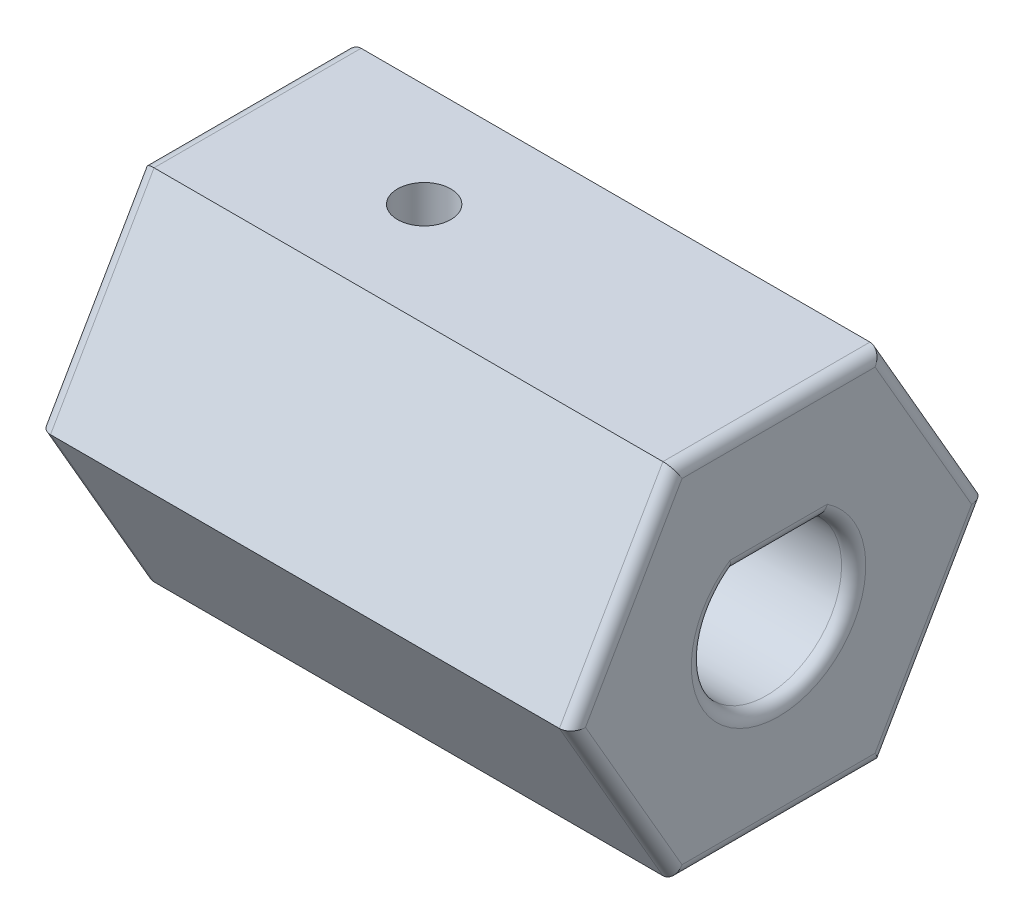
ISO-10303-21;
HEADER;
FILE_DESCRIPTION(('STEP AP214'),'2;1');
FILE_NAME('part.step','',(''),(''),'','','');
FILE_SCHEMA(('AUTOMOTIVE_DESIGN { 1 0 10303 214 1 1 1 1 }'));
ENDSEC;
DATA;
#1=APPLICATION_CONTEXT('core data for automotive mechanical design processes');
#2=APPLICATION_PROTOCOL_DEFINITION('international standard','automotive_design',2000,#1);
#3=PRODUCT_CONTEXT('',#1,'mechanical');
#4=PRODUCT('Part','Part','',(#3));
#5=PRODUCT_RELATED_PRODUCT_CATEGORY('part','',(#4));
#6=PRODUCT_DEFINITION_FORMATION('','',#4);
#7=PRODUCT_DEFINITION_CONTEXT('part definition',#1,'design');
#8=PRODUCT_DEFINITION('design','',#6,#7);
#9=PRODUCT_DEFINITION_SHAPE('','',#8);
#10=(LENGTH_UNIT() NAMED_UNIT(*) SI_UNIT(.MILLI.,.METRE.));
#11=(NAMED_UNIT(*) PLANE_ANGLE_UNIT() SI_UNIT($,.RADIAN.));
#12=(NAMED_UNIT(*) SI_UNIT($,.STERADIAN.) SOLID_ANGLE_UNIT());
#13=UNCERTAINTY_MEASURE_WITH_UNIT(LENGTH_MEASURE(1.E-05),#10,'distance_accuracy_value','');
#14=(GEOMETRIC_REPRESENTATION_CONTEXT(3) GLOBAL_UNCERTAINTY_ASSIGNED_CONTEXT((#13)) GLOBAL_UNIT_ASSIGNED_CONTEXT((#10,
#11,#12)) REPRESENTATION_CONTEXT('',''));
#15=CARTESIAN_POINT('',(0.,0.,0.));
#16=DIRECTION('',(0.,0.,1.));
#17=DIRECTION('',(1.,0.,0.));
#18=AXIS2_PLACEMENT_3D('',#15,#16,#17);
#19=CARTESIAN_POINT('',(22.,0.,0.));
#20=DIRECTION('',(1.,0.,0.));
#21=DIRECTION('',(0.,0.,-1.));
#22=AXIS2_PLACEMENT_3D('',#19,#20,#21);
#23=PLANE('',#22);
#24=DIRECTION('',(0.,0.,1.));
#25=VECTOR('',#24,1.);
#26=CARTESIAN_POINT('',(22.,2.98746859276655,-1.85));
#27=LINE('',#26,#25);
#28=CARTESIAN_POINT('',(22.,2.98746859276655,2.00873876032536));
#29=VERTEX_POINT('',#28);
#30=CARTESIAN_POINT('',(22.,2.98746859276655,-2.00873876032536));
#31=VERTEX_POINT('',#30);
#32=EDGE_CURVE('E64',#29,#31,#27,.F.);
#33=ORIENTED_EDGE('',*,*,#32,.T.);
#34=CARTESIAN_POINT('',(22.,0.,0.));
#35=DIRECTION('',(1.,0.,0.));
#36=DIRECTION('',(0.,0.,-1.));
#37=AXIS2_PLACEMENT_3D('',#34,#35,#36);
#38=CIRCLE('',#37,3.6);
#39=EDGE_CURVE('E12',#31,#29,#38,.F.);
#40=ORIENTED_EDGE('',*,*,#39,.T.);
#41=EDGE_LOOP('',(#33,#40));
#42=FACE_BOUND('',#41,.T.);
#43=DIRECTION('',(0.,0.,1.));
#44=VECTOR('',#43,1.);
#45=CARTESIAN_POINT('',(22.,6.9,4.27239199200323));
#46=LINE('',#45,#44);
#47=CARTESIAN_POINT('',(22.,6.9,-3.98371685740842));
#48=VERTEX_POINT('',#47);
#49=CARTESIAN_POINT('',(22.,6.9,3.98371685740842));
#50=VERTEX_POINT('',#49);
#51=EDGE_CURVE('E232',#48,#50,#46,.T.);
#52=ORIENTED_EDGE('',*,*,#51,.T.);
#53=DIRECTION('',(0.,-0.866025403784439,0.5));
#54=VECTOR('',#53,1.);
#55=CARTESIAN_POINT('',(22.,-0.249999999999998,8.11177128211424));
#56=LINE('',#55,#54);
#57=CARTESIAN_POINT('',(22.,0.,7.96743371481684));
#58=VERTEX_POINT('',#57);
#59=EDGE_CURVE('E234',#50,#58,#56,.T.);
#60=ORIENTED_EDGE('',*,*,#59,.T.);
#61=DIRECTION('',(0.,-0.866025403784438,-0.5));
#62=VECTOR('',#61,1.);
#63=CARTESIAN_POINT('',(22.,-7.15,3.83937929011101));
#64=LINE('',#63,#62);
#65=CARTESIAN_POINT('',(22.,-6.9,3.98371685740841));
#66=VERTEX_POINT('',#65);
#67=EDGE_CURVE('E225',#58,#66,#64,.T.);
#68=ORIENTED_EDGE('',*,*,#67,.T.);
#69=DIRECTION('',(0.,0.,-1.));
#70=VECTOR('',#69,1.);
#71=CARTESIAN_POINT('',(22.,-6.9,-4.27239199200323));
#72=LINE('',#71,#70);
#73=CARTESIAN_POINT('',(22.,-6.9,-3.98371685740842));
#74=VERTEX_POINT('',#73);
#75=EDGE_CURVE('E199',#66,#74,#72,.T.);
#76=ORIENTED_EDGE('',*,*,#75,.T.);
#77=DIRECTION('',(0.,0.866025403784439,-0.5));
#78=VECTOR('',#77,1.);
#79=CARTESIAN_POINT('',(22.,0.250000000000004,-8.11177128211425));
#80=LINE('',#79,#78);
#81=CARTESIAN_POINT('',(22.,0.,-7.96743371481684));
#82=VERTEX_POINT('',#81);
#83=EDGE_CURVE('E228',#74,#82,#80,.T.);
#84=ORIENTED_EDGE('',*,*,#83,.T.);
#85=DIRECTION('',(0.,0.866025403784438,0.5));
#86=VECTOR('',#85,1.);
#87=CARTESIAN_POINT('',(22.,7.15,-3.83937929011101));
#88=LINE('',#87,#86);
#89=EDGE_CURVE('E230',#82,#48,#88,.T.);
#90=ORIENTED_EDGE('',*,*,#89,.T.);
#91=EDGE_LOOP('',(#52,#60,#68,#76,#84,#90));
#92=FACE_BOUND('',#91,.T.);
#93=ADVANCED_FACE('F55',(#42,#92),#23,.T.);
#94=CARTESIAN_POINT('',(22.,0.,8.54478398400646));
#95=DIRECTION('',(0.,0.5,-0.866025403784438));
#96=DIRECTION('',(0.,0.866025403784438,0.5));
#97=AXIS2_PLACEMENT_3D('',#94,#95,#96);
#98=PLANE('',#97);
#99=DIRECTION('',(-1.,0.,0.));
#100=VECTOR('',#99,1.);
#101=CARTESIAN_POINT('',(22.,0.,8.54478398400646));
#102=LINE('',#101,#100);
#103=CARTESIAN_POINT('',(21.5,0.,8.54478398400646));
#104=VERTEX_POINT('',#103);
#105=CARTESIAN_POINT('',(0.5,0.,8.54478398400646));
#106=VERTEX_POINT('',#105);
#107=EDGE_CURVE('E361',#104,#106,#102,.T.);
#108=ORIENTED_EDGE('',*,*,#107,.T.);
#109=DIRECTION('',(0.,-0.866025403784438,-0.5));
#110=VECTOR('',#109,1.);
#111=CARTESIAN_POINT('',(0.5,0.,8.54478398400646));
#112=LINE('',#111,#110);
#113=CARTESIAN_POINT('',(0.5,-7.4,4.27239199200323));
#114=VERTEX_POINT('',#113);
#115=EDGE_CURVE('E192',#106,#114,#112,.T.);
#116=ORIENTED_EDGE('',*,*,#115,.T.);
#117=DIRECTION('',(-1.,0.,0.));
#118=VECTOR('',#117,1.);
#119=CARTESIAN_POINT('',(22.,-7.4,4.27239199200323));
#120=LINE('',#119,#118);
#121=CARTESIAN_POINT('',(21.5,-7.4,4.27239199200323));
#122=VERTEX_POINT('',#121);
#123=EDGE_CURVE('E174',#122,#114,#120,.T.);
#124=ORIENTED_EDGE('',*,*,#123,.F.);
#125=DIRECTION('',(0.,-0.866025403784438,-0.5));
#126=VECTOR('',#125,1.);
#127=CARTESIAN_POINT('',(21.5,0.,8.54478398400646));
#128=LINE('',#127,#126);
#129=EDGE_CURVE('E189',#122,#104,#128,.F.);
#130=ORIENTED_EDGE('',*,*,#129,.T.);
#131=EDGE_LOOP('',(#108,#116,#124,#130));
#132=FACE_BOUND('',#131,.T.);
#133=ADVANCED_FACE('F187',(#132),#98,.F.);
#134=CARTESIAN_POINT('',(22.,-7.4,4.27239199200323));
#135=DIRECTION('',(0.,1.,0.));
#136=DIRECTION('',(0.,0.,1.));
#137=AXIS2_PLACEMENT_3D('',#134,#135,#136);
#138=PLANE('',#137);
#139=ORIENTED_EDGE('',*,*,#123,.T.);
#140=DIRECTION('',(0.,0.,-1.));
#141=VECTOR('',#140,1.);
#142=CARTESIAN_POINT('',(0.5,-7.4,4.27239199200323));
#143=LINE('',#142,#141);
#144=CARTESIAN_POINT('',(0.5,-7.4,-4.27239199200323));
#145=VERTEX_POINT('',#144);
#146=EDGE_CURVE('E182',#114,#145,#143,.T.);
#147=ORIENTED_EDGE('',*,*,#146,.T.);
#148=DIRECTION('',(-1.,0.,0.));
#149=VECTOR('',#148,1.);
#150=CARTESIAN_POINT('',(22.,-7.4,-4.27239199200323));
#151=LINE('',#150,#149);
#152=CARTESIAN_POINT('',(21.5,-7.4,-4.27239199200323));
#153=VERTEX_POINT('',#152);
#154=EDGE_CURVE('E177',#153,#145,#151,.T.);
#155=ORIENTED_EDGE('',*,*,#154,.F.);
#156=DIRECTION('',(0.,0.,-1.));
#157=VECTOR('',#156,1.);
#158=CARTESIAN_POINT('',(21.5,-7.4,4.27239199200323));
#159=LINE('',#158,#157);
#160=EDGE_CURVE('E170',#153,#122,#159,.F.);
#161=ORIENTED_EDGE('',*,*,#160,.T.);
#162=EDGE_LOOP('',(#139,#147,#155,#161));
#163=FACE_BOUND('',#162,.T.);
#164=ADVANCED_FACE('F172',(#163),#138,.F.);
#165=CARTESIAN_POINT('',(22.,-7.4,-4.27239199200323));
#166=DIRECTION('',(0.,0.5,0.866025403784439));
#167=DIRECTION('',(0.,-0.866025403784439,0.5));
#168=AXIS2_PLACEMENT_3D('',#165,#166,#167);
#169=PLANE('',#168);
#170=ORIENTED_EDGE('',*,*,#154,.T.);
#171=DIRECTION('',(0.,0.866025403784439,-0.5));
#172=VECTOR('',#171,1.);
#173=CARTESIAN_POINT('',(0.5,-7.4,-4.27239199200323));
#174=LINE('',#173,#172);
#175=CARTESIAN_POINT('',(0.5,0.,-8.54478398400646));
#176=VERTEX_POINT('',#175);
#177=EDGE_CURVE('E344',#145,#176,#174,.T.);
#178=ORIENTED_EDGE('',*,*,#177,.T.);
#179=DIRECTION('',(-1.,0.,0.));
#180=VECTOR('',#179,1.);
#181=CARTESIAN_POINT('',(22.,0.,-8.54478398400646));
#182=LINE('',#181,#180);
#183=CARTESIAN_POINT('',(21.5,0.,-8.54478398400646));
#184=VERTEX_POINT('',#183);
#185=EDGE_CURVE('E371',#184,#176,#182,.T.);
#186=ORIENTED_EDGE('',*,*,#185,.F.);
#187=DIRECTION('',(0.,0.866025403784439,-0.5));
#188=VECTOR('',#187,1.);
#189=CARTESIAN_POINT('',(21.5,-7.4,-4.27239199200323));
#190=LINE('',#189,#188);
#191=EDGE_CURVE('E342',#184,#153,#190,.F.);
#192=ORIENTED_EDGE('',*,*,#191,.T.);
#193=EDGE_LOOP('',(#170,#178,#186,#192));
#194=FACE_BOUND('',#193,.T.);
#195=ADVANCED_FACE('F379',(#194),#169,.F.);
#196=CARTESIAN_POINT('',(22.,0.,-8.54478398400646));
#197=DIRECTION('',(0.,-0.5,0.866025403784438));
#198=DIRECTION('',(0.,-0.866025403784438,-0.5));
#199=AXIS2_PLACEMENT_3D('',#196,#197,#198);
#200=PLANE('',#199);
#201=ORIENTED_EDGE('',*,*,#185,.T.);
#202=DIRECTION('',(0.,0.866025403784438,0.5));
#203=VECTOR('',#202,1.);
#204=CARTESIAN_POINT('',(0.5,0.,-8.54478398400646));
#205=LINE('',#204,#203);
#206=CARTESIAN_POINT('',(0.5,7.4,-4.27239199200323));
#207=VERTEX_POINT('',#206);
#208=EDGE_CURVE('E348',#176,#207,#205,.T.);
#209=ORIENTED_EDGE('',*,*,#208,.T.);
#210=DIRECTION('',(-1.,0.,0.));
#211=VECTOR('',#210,1.);
#212=CARTESIAN_POINT('',(22.,7.4,-4.27239199200323));
#213=LINE('',#212,#211);
#214=CARTESIAN_POINT('',(21.5,7.4,-4.27239199200323));
#215=VERTEX_POINT('',#214);
#216=EDGE_CURVE('E369',#215,#207,#213,.T.);
#217=ORIENTED_EDGE('',*,*,#216,.F.);
#218=DIRECTION('',(0.,0.866025403784438,0.5));
#219=VECTOR('',#218,1.);
#220=CARTESIAN_POINT('',(21.5,0.,-8.54478398400646));
#221=LINE('',#220,#219);
#222=EDGE_CURVE('E346',#215,#184,#221,.F.);
#223=ORIENTED_EDGE('',*,*,#222,.T.);
#224=EDGE_LOOP('',(#201,#209,#217,#223));
#225=FACE_BOUND('',#224,.T.);
#226=ADVANCED_FACE('F395',(#225),#200,.F.);
#227=CARTESIAN_POINT('',(22.,7.4,-4.27239199200323));
#228=DIRECTION('',(0.,-1.,0.));
#229=DIRECTION('',(0.,0.,-1.));
#230=AXIS2_PLACEMENT_3D('',#227,#228,#229);
#231=PLANE('',#230);
#232=CARTESIAN_POINT('',(7.375,7.4,0.));
#233=DIRECTION('',(0.,-1.,0.));
#234=DIRECTION('',(0.,0.,-1.));
#235=AXIS2_PLACEMENT_3D('',#232,#233,#234);
#236=CIRCLE('',#235,1.1);
#237=CARTESIAN_POINT('',(7.375,7.4,-1.1));
#238=VERTEX_POINT('',#237);
#239=EDGE_CURVE('E373',#238,#238,#236,.F.);
#240=ORIENTED_EDGE('',*,*,#239,.F.);
#241=EDGE_LOOP('',(#240));
#242=FACE_BOUND('',#241,.T.);
#243=ORIENTED_EDGE('',*,*,#216,.T.);
#244=DIRECTION('',(0.,0.,1.));
#245=VECTOR('',#244,1.);
#246=CARTESIAN_POINT('',(0.5,7.4,-4.27239199200323));
#247=LINE('',#246,#245);
#248=CARTESIAN_POINT('',(0.5,7.4,4.27239199200323));
#249=VERTEX_POINT('',#248);
#250=EDGE_CURVE('E352',#207,#249,#247,.T.);
#251=ORIENTED_EDGE('',*,*,#250,.T.);
#252=DIRECTION('',(-1.,0.,0.));
#253=VECTOR('',#252,1.);
#254=CARTESIAN_POINT('',(22.,7.4,4.27239199200323));
#255=LINE('',#254,#253);
#256=CARTESIAN_POINT('',(21.5,7.4,4.27239199200323));
#257=VERTEX_POINT('',#256);
#258=EDGE_CURVE('E359',#257,#249,#255,.T.);
#259=ORIENTED_EDGE('',*,*,#258,.F.);
#260=DIRECTION('',(0.,0.,1.));
#261=VECTOR('',#260,1.);
#262=CARTESIAN_POINT('',(21.5,7.4,-4.27239199200323));
#263=LINE('',#262,#261);
#264=EDGE_CURVE('E350',#257,#215,#263,.F.);
#265=ORIENTED_EDGE('',*,*,#264,.T.);
#266=EDGE_LOOP('',(#243,#251,#259,#265));
#267=FACE_BOUND('',#266,.T.);
#268=ADVANCED_FACE('F365',(#242,#267),#231,.F.);
#269=CARTESIAN_POINT('',(22.,7.4,4.27239199200323));
#270=DIRECTION('',(0.,-0.5,-0.866025403784439));
#271=DIRECTION('',(0.,0.866025403784439,-0.5));
#272=AXIS2_PLACEMENT_3D('',#269,#270,#271);
#273=PLANE('',#272);
#274=ORIENTED_EDGE('',*,*,#258,.T.);
#275=DIRECTION('',(0.,-0.866025403784439,0.5));
#276=VECTOR('',#275,1.);
#277=CARTESIAN_POINT('',(0.5,7.4,4.27239199200323));
#278=LINE('',#277,#276);
#279=EDGE_CURVE('E208',#249,#106,#278,.T.);
#280=ORIENTED_EDGE('',*,*,#279,.T.);
#281=ORIENTED_EDGE('',*,*,#107,.F.);
#282=DIRECTION('',(0.,-0.866025403784439,0.5));
#283=VECTOR('',#282,1.);
#284=CARTESIAN_POINT('',(21.5,7.4,4.27239199200323));
#285=LINE('',#284,#283);
#286=EDGE_CURVE('E212',#104,#257,#285,.F.);
#287=ORIENTED_EDGE('',*,*,#286,.T.);
#288=EDGE_LOOP('',(#274,#280,#281,#287));
#289=FACE_BOUND('',#288,.T.);
#290=ADVANCED_FACE('F358',(#289),#273,.F.);
#291=CARTESIAN_POINT('',(0.,0.,0.));
#292=DIRECTION('',(1.,0.,0.));
#293=DIRECTION('',(0.,0.,-1.));
#294=AXIS2_PLACEMENT_3D('',#291,#292,#293);
#295=PLANE('',#294);
#296=DIRECTION('',(0.,0.866025403784439,-0.5));
#297=VECTOR('',#296,1.);
#298=CARTESIAN_POINT('',(0.,-3.45,-5.97557528611263));
#299=LINE('',#298,#297);
#300=CARTESIAN_POINT('',(0.,0.,-7.96743371481684));
#301=VERTEX_POINT('',#300);
#302=CARTESIAN_POINT('',(0.,-6.9,-3.98371685740842));
#303=VERTEX_POINT('',#302);
#304=EDGE_CURVE('E337',#301,#303,#299,.F.);
#305=ORIENTED_EDGE('',*,*,#304,.T.);
#306=DIRECTION('',(0.,0.,-1.));
#307=VECTOR('',#306,1.);
#308=CARTESIAN_POINT('',(0.,-6.9,0.));
#309=LINE('',#308,#307);
#310=CARTESIAN_POINT('',(0.,-6.9,3.98371685740841));
#311=VERTEX_POINT('',#310);
#312=EDGE_CURVE('E339',#303,#311,#309,.F.);
#313=ORIENTED_EDGE('',*,*,#312,.T.);
#314=DIRECTION('',(0.,-0.866025403784438,-0.5));
#315=VECTOR('',#314,1.);
#316=CARTESIAN_POINT('',(0.,-3.45,5.97557528611262));
#317=LINE('',#316,#315);
#318=CARTESIAN_POINT('',(0.,0.,7.96743371481684));
#319=VERTEX_POINT('',#318);
#320=EDGE_CURVE('E329',#311,#319,#317,.F.);
#321=ORIENTED_EDGE('',*,*,#320,.T.);
#322=DIRECTION('',(0.,-0.866025403784439,0.5));
#323=VECTOR('',#322,1.);
#324=CARTESIAN_POINT('',(0.,3.45,5.97557528611263));
#325=LINE('',#324,#323);
#326=CARTESIAN_POINT('',(0.,6.9,3.98371685740842));
#327=VERTEX_POINT('',#326);
#328=EDGE_CURVE('E331',#319,#327,#325,.F.);
#329=ORIENTED_EDGE('',*,*,#328,.T.);
#330=DIRECTION('',(0.,0.,1.));
#331=VECTOR('',#330,1.);
#332=CARTESIAN_POINT('',(0.,6.9,0.));
#333=LINE('',#332,#331);
#334=CARTESIAN_POINT('',(0.,6.9,-3.98371685740842));
#335=VERTEX_POINT('',#334);
#336=EDGE_CURVE('E333',#327,#335,#333,.F.);
#337=ORIENTED_EDGE('',*,*,#336,.T.);
#338=DIRECTION('',(0.,0.866025403784438,0.5));
#339=VECTOR('',#338,1.);
#340=CARTESIAN_POINT('',(0.,3.45,-5.97557528611263));
#341=LINE('',#340,#339);
#342=EDGE_CURVE('E335',#335,#301,#341,.F.);
#343=ORIENTED_EDGE('',*,*,#342,.T.);
#344=EDGE_LOOP('',(#305,#313,#321,#329,#337,#343));
#345=FACE_BOUND('',#344,.T.);
#346=CARTESIAN_POINT('',(0.,0.,0.));
#347=DIRECTION('',(1.,0.,0.));
#348=DIRECTION('',(0.,0.,-1.));
#349=AXIS2_PLACEMENT_3D('',#346,#347,#348);
#350=CIRCLE('',#349,3.6);
#351=CARTESIAN_POINT('',(0.,2.98746859276655,2.00873876032536));
#352=VERTEX_POINT('',#351);
#353=CARTESIAN_POINT('',(0.,2.98746859276655,-2.00873876032536));
#354=VERTEX_POINT('',#353);
#355=EDGE_CURVE('E324',#352,#354,#350,.T.);
#356=ORIENTED_EDGE('',*,*,#355,.T.);
#357=DIRECTION('',(0.,0.,-1.));
#358=VECTOR('',#357,1.);
#359=CARTESIAN_POINT('',(0.,2.98746859276655,0.));
#360=LINE('',#359,#358);
#361=EDGE_CURVE('E326',#354,#352,#360,.F.);
#362=ORIENTED_EDGE('',*,*,#361,.T.);
#363=EDGE_LOOP('',(#356,#362));
#364=FACE_BOUND('',#363,.T.);
#365=ADVANCED_FACE('F408',(#345,#364),#295,.F.);
#366=CARTESIAN_POINT('',(12.,2.48746859276655,0.));
#367=DIRECTION('',(0.,1.,0.));
#368=DIRECTION('',(0.,0.,1.));
#369=AXIS2_PLACEMENT_3D('',#366,#367,#368);
#370=PLANE('',#369);
#371=CARTESIAN_POINT('',(7.375,2.48746859276655,0.));
#372=DIRECTION('',(0.,-1.,0.));
#373=DIRECTION('',(0.,0.,-1.));
#374=AXIS2_PLACEMENT_3D('',#371,#372,#373);
#375=CIRCLE('',#374,1.1);
#376=CARTESIAN_POINT('',(7.375,2.48746859276655,-1.1));
#377=VERTEX_POINT('',#376);
#378=EDGE_CURVE('E255',#377,#377,#375,.T.);
#379=ORIENTED_EDGE('',*,*,#378,.F.);
#380=EDGE_LOOP('',(#379));
#381=FACE_BOUND('',#380,.T.);
#382=DIRECTION('',(-1.,0.,0.));
#383=VECTOR('',#382,1.);
#384=CARTESIAN_POINT('',(12.,2.48746859276655,1.85));
#385=LINE('',#384,#383);
#386=CARTESIAN_POINT('',(21.5,2.48746859276655,1.85));
#387=VERTEX_POINT('',#386);
#388=CARTESIAN_POINT('',(0.5,2.48746859276655,1.85));
#389=VERTEX_POINT('',#388);
#390=EDGE_CURVE('E183',#387,#389,#385,.T.);
#391=ORIENTED_EDGE('',*,*,#390,.T.);
#392=DIRECTION('',(0.,0.,-1.));
#393=VECTOR('',#392,1.);
#394=CARTESIAN_POINT('',(0.5,2.48746859276655,0.));
#395=LINE('',#394,#393);
#396=CARTESIAN_POINT('',(0.5,2.48746859276655,-1.85));
#397=VERTEX_POINT('',#396);
#398=EDGE_CURVE('E217',#389,#397,#395,.T.);
#399=ORIENTED_EDGE('',*,*,#398,.T.);
#400=DIRECTION('',(-1.,0.,0.));
#401=VECTOR('',#400,1.);
#402=CARTESIAN_POINT('',(12.,2.48746859276655,-1.85));
#403=LINE('',#402,#401);
#404=CARTESIAN_POINT('',(21.5,2.48746859276655,-1.85));
#405=VERTEX_POINT('',#404);
#406=EDGE_CURVE('E193',#405,#397,#403,.T.);
#407=ORIENTED_EDGE('',*,*,#406,.F.);
#408=DIRECTION('',(0.,0.,1.));
#409=VECTOR('',#408,1.);
#410=CARTESIAN_POINT('',(21.5,2.48746859276655,1.85));
#411=LINE('',#410,#409);
#412=EDGE_CURVE('E210',#405,#387,#411,.T.);
#413=ORIENTED_EDGE('',*,*,#412,.T.);
#414=EDGE_LOOP('',(#391,#399,#407,#413));
#415=FACE_BOUND('',#414,.T.);
#416=ADVANCED_FACE('F317',(#381,#415),#370,.F.);
#417=CARTESIAN_POINT('',(12.,0.,0.));
#418=DIRECTION('',(-1.,0.,0.));
#419=DIRECTION('',(0.,0.,1.));
#420=AXIS2_PLACEMENT_3D('',#417,#418,#419);
#421=CYLINDRICAL_SURFACE('',#420,3.1);
#422=ORIENTED_EDGE('',*,*,#406,.T.);
#423=CARTESIAN_POINT('',(0.5,0.,0.));
#424=DIRECTION('',(1.,0.,0.));
#425=DIRECTION('',(0.,0.,-1.));
#426=AXIS2_PLACEMENT_3D('',#423,#424,#425);
#427=CIRCLE('',#426,3.1);
#428=EDGE_CURVE('E223',#397,#389,#427,.F.);
#429=ORIENTED_EDGE('',*,*,#428,.T.);
#430=ORIENTED_EDGE('',*,*,#390,.F.);
#431=CARTESIAN_POINT('',(21.5,0.,0.));
#432=DIRECTION('',(1.,0.,0.));
#433=DIRECTION('',(0.,0.,-1.));
#434=AXIS2_PLACEMENT_3D('',#431,#432,#433);
#435=CIRCLE('',#434,3.1);
#436=EDGE_CURVE('E220',#387,#405,#435,.T.);
#437=ORIENTED_EDGE('',*,*,#436,.T.);
#438=EDGE_LOOP('',(#422,#429,#430,#437));
#439=FACE_BOUND('',#438,.T.);
#440=ADVANCED_FACE('F316',(#439),#421,.F.);
#441=CARTESIAN_POINT('',(7.375,10.5112698372208,0.));
#442=DIRECTION('',(0.,-1.,0.));
#443=DIRECTION('',(0.,0.,-1.));
#444=AXIS2_PLACEMENT_3D('',#441,#442,#443);
#445=CYLINDRICAL_SURFACE('',#444,1.1);
#446=CARTESIAN_POINT('',(7.375,7.4,-1.1));
#447=CARTESIAN_POINT('',(7.375,7.34882779784132,-1.1));
#448=CARTESIAN_POINT('',(7.375,7.29765559568264,-1.1));
#449=CARTESIAN_POINT('',(7.375,7.19531119136527,-1.1));
#450=CARTESIAN_POINT('',(7.375,7.14413898920659,-1.1));
#451=CARTESIAN_POINT('',(7.375,7.04179458488923,-1.1));
#452=CARTESIAN_POINT('',(7.375,6.99062238273055,-1.1));
#453=CARTESIAN_POINT('',(7.375,6.88827797841318,-1.1));
#454=CARTESIAN_POINT('',(7.375,6.8371057762545,-1.1));
#455=CARTESIAN_POINT('',(7.375,6.73476137193714,-1.1));
#456=CARTESIAN_POINT('',(7.375,6.68358916977846,-1.1));
#457=CARTESIAN_POINT('',(7.375,6.58124476546109,-1.1));
#458=CARTESIAN_POINT('',(7.375,6.53007256330241,-1.1));
#459=CARTESIAN_POINT('',(7.375,6.42772815898505,-1.1));
#460=CARTESIAN_POINT('',(7.375,6.37655595682637,-1.1));
#461=CARTESIAN_POINT('',(7.375,6.274211552509,-1.1));
#462=CARTESIAN_POINT('',(7.375,6.22303935035032,-1.1));
#463=CARTESIAN_POINT('',(7.375,6.12069494603296,-1.1));
#464=CARTESIAN_POINT('',(7.375,6.06952274387428,-1.1));
#465=CARTESIAN_POINT('',(7.375,5.96717833955691,-1.1));
#466=CARTESIAN_POINT('',(7.375,5.91600613739823,-1.1));
#467=CARTESIAN_POINT('',(7.375,5.81366173308087,-1.1));
#468=CARTESIAN_POINT('',(7.375,5.76248953092218,-1.1));
#469=CARTESIAN_POINT('',(7.375,5.66014512660482,-1.1));
#470=CARTESIAN_POINT('',(7.375,5.60897292444614,-1.1));
#471=CARTESIAN_POINT('',(7.375,5.50662852012878,-1.1));
#472=CARTESIAN_POINT('',(7.375,5.45545631797009,-1.1));
#473=CARTESIAN_POINT('',(7.375,5.35311191365273,-1.1));
#474=CARTESIAN_POINT('',(7.375,5.30193971149405,-1.1));
#475=CARTESIAN_POINT('',(7.375,5.19959530717668,-1.1));
#476=CARTESIAN_POINT('',(7.375,5.148423105018,-1.1));
#477=CARTESIAN_POINT('',(7.375,5.04607870070064,-1.1));
#478=CARTESIAN_POINT('',(7.375,4.99490649854196,-1.1));
#479=CARTESIAN_POINT('',(7.375,4.8925620942246,-1.1));
#480=CARTESIAN_POINT('',(7.375,4.84138989206591,-1.1));
#481=CARTESIAN_POINT('',(7.375,4.73904548774855,-1.1));
#482=CARTESIAN_POINT('',(7.375,4.68787328558987,-1.1));
#483=CARTESIAN_POINT('',(7.375,4.5855288812725,-1.1));
#484=CARTESIAN_POINT('',(7.375,4.53435667911382,-1.1));
#485=CARTESIAN_POINT('',(7.375,4.43201227479646,-1.1));
#486=CARTESIAN_POINT('',(7.375,4.38084007263778,-1.1));
#487=CARTESIAN_POINT('',(7.375,4.27849566832041,-1.1));
#488=CARTESIAN_POINT('',(7.375,4.22732346616173,-1.1));
#489=CARTESIAN_POINT('',(7.375,4.12497906184437,-1.1));
#490=CARTESIAN_POINT('',(7.375,4.07380685968568,-1.1));
#491=CARTESIAN_POINT('',(7.375,3.97146245536832,-1.1));
#492=CARTESIAN_POINT('',(7.375,3.92029025320964,-1.1));
#493=CARTESIAN_POINT('',(7.375,3.81794584889228,-1.1));
#494=CARTESIAN_POINT('',(7.375,3.76677364673359,-1.1));
#495=CARTESIAN_POINT('',(7.375,3.66442924241623,-1.1));
#496=CARTESIAN_POINT('',(7.375,3.61325704025755,-1.1));
#497=CARTESIAN_POINT('',(7.375,3.51091263594019,-1.1));
#498=CARTESIAN_POINT('',(7.375,3.4597404337815,-1.1));
#499=CARTESIAN_POINT('',(7.375,3.35739602946414,-1.1));
#500=CARTESIAN_POINT('',(7.375,3.30622382730546,-1.1));
#501=CARTESIAN_POINT('',(7.375,3.20387942298809,-1.1));
#502=CARTESIAN_POINT('',(7.375,3.15270722082941,-1.1));
#503=CARTESIAN_POINT('',(7.375,3.05036281651205,-1.1));
#504=CARTESIAN_POINT('',(7.375,2.99919061435337,-1.1));
#505=CARTESIAN_POINT('',(7.375,2.896846210036,-1.1));
#506=CARTESIAN_POINT('',(7.375,2.84567400787732,-1.1));
#507=CARTESIAN_POINT('',(7.375,2.74332960355996,-1.1));
#508=CARTESIAN_POINT('',(7.375,2.69215740140128,-1.1));
#509=CARTESIAN_POINT('',(7.375,2.58981299708391,-1.1));
#510=CARTESIAN_POINT('',(7.375,2.53864079492523,-1.1));
#511=CARTESIAN_POINT('',(7.375,2.48746859276655,-1.1));
#512=B_SPLINE_CURVE_WITH_KNOTS('',3,(#446,#447,#448,#449,#450,#451,#452,#453,#454,#455,#456,
#457,#458,#459,#460,#461,#462,#463,#464,#465,#466,#467,#468,#469,#470,#471,#472,#473,#474,#475,
#476,#477,#478,#479,#480,#481,#482,#483,#484,#485,#486,#487,#488,#489,#490,#491,#492,#493,#494,
#495,#496,#497,#498,#499,#500,#501,#502,#503,#504,#505,#506,#507,#508,#509,#510,#511),
.UNSPECIFIED.,.F.,.F.,(4,2,2,2,2,2,2,2,2,2,2,2,2,2,2,2,2,2,2,2,2,2,2,2,2,2,2,2,2,2,2,2,4),(0.,
0.153516606476046,0.307033212952092,0.460549819428137,0.614066425904182,0.767583032380228,
0.921099638856272,1.07461624533232,1.22813285180836,1.38164945828441,1.53516606476045,
1.6886826712365,1.84219927771254,1.99571588418859,2.14923249066464,2.30274909714068,
2.45626570361673,2.60978231009277,2.76329891656882,2.91681552304486,3.07033212952091,
3.22384873599695,3.377365342473,3.53088194894904,3.68439855542509,3.83791516190113,
3.99143176837718,4.14494837485323,4.29846498132927,4.45198158780532,4.60549819428136,
4.75901480075741,4.91253140723345),.UNSPECIFIED.);
#513=EDGE_CURVE('BSEAM440',#238,#377,#512,.T.);
#514=ORIENTED_EDGE('',*,*,#239,.T.);
#515=ORIENTED_EDGE('',*,*,#378,.T.);
#516=ORIENTED_EDGE('',*,*,#513,.T.);
#517=ORIENTED_EDGE('',*,*,#513,.F.);
#518=EDGE_LOOP('',(#514,#516,#515,#517));
#519=FACE_BOUND('',#518,.T.);
#520=ADVANCED_FACE('F440',(#519),#445,.F.);
#521=CARTESIAN_POINT('',(0.5,6.9,-4.27239199200323));
#522=DIRECTION('',(0.,0.,1.));
#523=DIRECTION('',(1.,0.,0.));
#524=AXIS2_PLACEMENT_3D('',#521,#522,#523);
#525=CYLINDRICAL_SURFACE('',#524,0.5);
#526=CARTESIAN_POINT('',(0.5,6.9,-3.98371685740842));
#527=DIRECTION('',(0.,0.5,0.866025403784439));
#528=DIRECTION('',(0.,-0.866025403784439,0.5));
#529=AXIS2_PLACEMENT_3D('',#526,#527,#528);
#530=ELLIPSE('',#529,0.577350269189626,0.5);
#531=EDGE_CURVE('E249',#335,#207,#530,.F.);
#532=ORIENTED_EDGE('',*,*,#531,.F.);
#533=ORIENTED_EDGE('',*,*,#336,.F.);
#534=CARTESIAN_POINT('',(0.5,6.9,3.98371685740842));
#535=DIRECTION('',(0.,-0.5,0.866025403784439));
#536=DIRECTION('',(0.,-0.866025403784439,-0.5));
#537=AXIS2_PLACEMENT_3D('',#534,#535,#536);
#538=ELLIPSE('',#537,0.577350269189626,0.5);
#539=EDGE_CURVE('E252',#249,#327,#538,.T.);
#540=ORIENTED_EDGE('',*,*,#539,.F.);
#541=ORIENTED_EDGE('',*,*,#250,.F.);
#542=EDGE_LOOP('',(#532,#533,#540,#541));
#543=FACE_BOUND('',#542,.T.);
#544=ADVANCED_FACE('F399',(#543),#525,.T.);
#545=CARTESIAN_POINT('',(0.5,7.15,3.83937929011101));
#546=DIRECTION('',(0.,-0.866025403784439,0.5));
#547=DIRECTION('',(0.,-0.5,-0.866025403784439));
#548=AXIS2_PLACEMENT_3D('',#545,#546,#547);
#549=CYLINDRICAL_SURFACE('',#548,0.5);
#550=ORIENTED_EDGE('',*,*,#539,.T.);
#551=ORIENTED_EDGE('',*,*,#328,.F.);
#552=CARTESIAN_POINT('',(0.5,0.,7.96743371481684));
#553=DIRECTION('',(0.,-1.,0.));
#554=DIRECTION('',(0.,0.,-1.));
#555=AXIS2_PLACEMENT_3D('',#552,#553,#554);
#556=ELLIPSE('',#555,0.577350269189626,0.5);
#557=EDGE_CURVE('E246',#106,#319,#556,.T.);
#558=ORIENTED_EDGE('',*,*,#557,.F.);
#559=ORIENTED_EDGE('',*,*,#279,.F.);
#560=EDGE_LOOP('',(#550,#551,#558,#559));
#561=FACE_BOUND('',#560,.T.);
#562=ADVANCED_FACE('F413',(#561),#549,.T.);
#563=CARTESIAN_POINT('',(0.5,-0.249999999999996,-8.11177128211424));
#564=DIRECTION('',(0.,0.866025403784438,0.5));
#565=DIRECTION('',(0.,-0.5,0.866025403784438));
#566=AXIS2_PLACEMENT_3D('',#563,#564,#565);
#567=CYLINDRICAL_SURFACE('',#566,0.5);
#568=ORIENTED_EDGE('',*,*,#531,.T.);
#569=ORIENTED_EDGE('',*,*,#208,.F.);
#570=CARTESIAN_POINT('',(0.5,0.,-7.96743371481684));
#571=DIRECTION('',(0.,1.,0.));
#572=DIRECTION('',(0.,0.,1.));
#573=AXIS2_PLACEMENT_3D('',#570,#571,#572);
#574=ELLIPSE('',#573,0.577350269189626,0.5);
#575=EDGE_CURVE('E243',#301,#176,#574,.F.);
#576=ORIENTED_EDGE('',*,*,#575,.F.);
#577=ORIENTED_EDGE('',*,*,#342,.F.);
#578=EDGE_LOOP('',(#568,#569,#576,#577));
#579=FACE_BOUND('',#578,.T.);
#580=ADVANCED_FACE('F404',(#579),#567,.T.);
#581=CARTESIAN_POINT('',(0.5,0.250000000000002,8.11177128211424));
#582=DIRECTION('',(0.,-0.866025403784438,-0.5));
#583=DIRECTION('',(0.,0.5,-0.866025403784438));
#584=AXIS2_PLACEMENT_3D('',#581,#582,#583);
#585=CYLINDRICAL_SURFACE('',#584,0.5);
#586=ORIENTED_EDGE('',*,*,#557,.T.);
#587=ORIENTED_EDGE('',*,*,#320,.F.);
#588=CARTESIAN_POINT('',(0.5,-6.9,3.98371685740841));
#589=DIRECTION('',(0.,-0.5,-0.866025403784439));
#590=DIRECTION('',(0.,-0.866025403784439,0.5));
#591=AXIS2_PLACEMENT_3D('',#588,#589,#590);
#592=ELLIPSE('',#591,0.577350269189626,0.5);
#593=EDGE_CURVE('E240',#114,#311,#592,.T.);
#594=ORIENTED_EDGE('',*,*,#593,.F.);
#595=ORIENTED_EDGE('',*,*,#115,.F.);
#596=EDGE_LOOP('',(#586,#587,#594,#595));
#597=FACE_BOUND('',#596,.T.);
#598=ADVANCED_FACE('F417',(#597),#585,.T.);
#599=CARTESIAN_POINT('',(0.5,-7.15,-3.83937929011101));
#600=DIRECTION('',(0.,0.866025403784439,-0.5));
#601=DIRECTION('',(0.,0.5,0.866025403784439));
#602=AXIS2_PLACEMENT_3D('',#599,#600,#601);
#603=CYLINDRICAL_SURFACE('',#602,0.5);
#604=ORIENTED_EDGE('',*,*,#575,.T.);
#605=ORIENTED_EDGE('',*,*,#177,.F.);
#606=CARTESIAN_POINT('',(0.5,-6.9,-3.98371685740842));
#607=DIRECTION('',(0.,0.5,-0.866025403784438));
#608=DIRECTION('',(0.,0.866025403784439,0.5));
#609=AXIS2_PLACEMENT_3D('',#606,#607,#608);
#610=ELLIPSE('',#609,0.577350269189626,0.5);
#611=EDGE_CURVE('E238',#303,#145,#610,.F.);
#612=ORIENTED_EDGE('',*,*,#611,.F.);
#613=ORIENTED_EDGE('',*,*,#304,.F.);
#614=EDGE_LOOP('',(#604,#605,#612,#613));
#615=FACE_BOUND('',#614,.T.);
#616=ADVANCED_FACE('F422',(#615),#603,.T.);
#617=CARTESIAN_POINT('',(0.5,-6.9,4.27239199200323));
#618=DIRECTION('',(0.,0.,-1.));
#619=DIRECTION('',(0.,1.,0.));
#620=AXIS2_PLACEMENT_3D('',#617,#618,#619);
#621=CYLINDRICAL_SURFACE('',#620,0.5);
#622=ORIENTED_EDGE('',*,*,#593,.T.);
#623=ORIENTED_EDGE('',*,*,#312,.F.);
#624=ORIENTED_EDGE('',*,*,#611,.T.);
#625=ORIENTED_EDGE('',*,*,#146,.F.);
#626=EDGE_LOOP('',(#622,#623,#624,#625));
#627=FACE_BOUND('',#626,.T.);
#628=ADVANCED_FACE('F276',(#627),#621,.T.);
#629=CARTESIAN_POINT('',(0.5,0.,0.));
#630=DIRECTION('',(1.,0.,0.));
#631=DIRECTION('',(0.,0.,-1.));
#632=AXIS2_PLACEMENT_3D('',#629,#630,#631);
#633=TOROIDAL_SURFACE('',#632,3.6,0.5);
#634=CARTESIAN_POINT('',(0.5,2.48746859276655,-1.85));
#635=CARTESIAN_POINT('',(0.472873726603301,2.48744052334299,-1.84998905032929));
#636=CARTESIAN_POINT('',(0.445763578531908,2.48967419382108,-1.85073026356272));
#637=CARTESIAN_POINT('',(0.392386215877602,2.49844763491057,-1.85363257433995));
#638=CARTESIAN_POINT('',(0.366117280674095,2.50497793691434,-1.85579054970257));
#639=CARTESIAN_POINT('',(0.31510875514052,2.52212848339677,-1.86144245069345));
#640=CARTESIAN_POINT('',(0.290369076165844,2.53274849055378,-1.86493629880223));
#641=CARTESIAN_POINT('',(0.243057790319259,2.5577060716182,-1.87311561183725));
#642=CARTESIAN_POINT('',(0.220486627749002,2.57204440514708,-1.87780132024636));
#643=CARTESIAN_POINT('',(0.177581153767121,2.60434536988203,-1.88830863042953));
#644=CARTESIAN_POINT('',(0.157308354645021,2.62238206577043,-1.89415334834638));
#645=CARTESIAN_POINT('',(0.120053363265096,2.66132873608343,-1.9067063111082));
#646=CARTESIAN_POINT('',(0.103072348610666,2.68223973420598,-1.91341486355837));
#647=CARTESIAN_POINT('',(0.0720367185926079,2.72740409758931,-1.92782009426056));
#648=CARTESIAN_POINT('',(0.05815937080504,2.75176902997161,-1.9355485684669));
#649=CARTESIAN_POINT('',(0.034701026417549,2.80233833104396,-1.9514862513515));
#650=CARTESIAN_POINT('',(0.0251194539481632,2.82854245263677,-1.95969539542672));
#651=CARTESIAN_POINT('',(0.0121292707465289,2.87593217657064,-1.97444516165289));
#652=CARTESIAN_POINT('',(0.00780874608743641,2.89688981307379,-1.98093647018611));
#653=CARTESIAN_POINT('',(0.00188514111939656,2.93914522232096,-1.99395949216427));
#654=CARTESIAN_POINT('',(0.000277027578486029,2.96044229087641,-2.00049110814846));
#655=CARTESIAN_POINT('',(1.0905248487936E-05,2.98365101645179,-2.00757440275451));
#656=CARTESIAN_POINT('',(-2.87571696792252E-08,2.98555986021608,-2.00815672612228));
#657=CARTESIAN_POINT('',(0.,2.98746859276655,-2.00873876032536));
#658=B_SPLINE_CURVE_WITH_KNOTS('',3,(#634,#635,#636,#637,#638,#639,#640,#641,#642,#643,#644,
#645,#646,#647,#648,#649,#650,#651,#652,#653,#654,#655,#656,#657),.UNSPECIFIED.,.F.,.F.,(4,2,2,
2,2,2,2,2,2,2,2,4),(0.,0.0812521378842322,0.16232581519761,0.243394788592391,0.324480336732246,
0.407384235824617,0.49031773845674,0.577189672550961,0.664049957557526,0.730981529245226,
0.797788763491692,0.803775788003647),.UNSPECIFIED.);
#659=EDGE_CURVE('E256',#354,#397,#658,.F.);
#660=ORIENTED_EDGE('',*,*,#659,.F.);
#661=ORIENTED_EDGE('',*,*,#355,.F.);
#662=CARTESIAN_POINT('',(0.5,2.48746859276655,1.85));
#663=CARTESIAN_POINT('',(0.472873726603301,2.48744052334299,1.84998905032929));
#664=CARTESIAN_POINT('',(0.445763578531908,2.48967419382108,1.85073026356272));
#665=CARTESIAN_POINT('',(0.392386215877602,2.49844763491057,1.85363257433995));
#666=CARTESIAN_POINT('',(0.366117280674095,2.50497793691434,1.85579054970257));
#667=CARTESIAN_POINT('',(0.31510875514052,2.52212848339677,1.86144245069345));
#668=CARTESIAN_POINT('',(0.290369076165844,2.53274849055378,1.86493629880223));
#669=CARTESIAN_POINT('',(0.243057790319259,2.5577060716182,1.87311561183725));
#670=CARTESIAN_POINT('',(0.220486627749002,2.57204440514708,1.87780132024636));
#671=CARTESIAN_POINT('',(0.177581153767121,2.60434536988203,1.88830863042953));
#672=CARTESIAN_POINT('',(0.157308354645021,2.62238206577043,1.89415334834638));
#673=CARTESIAN_POINT('',(0.120053363265096,2.66132873608343,1.9067063111082));
#674=CARTESIAN_POINT('',(0.103072348610666,2.68223973420598,1.91341486355837));
#675=CARTESIAN_POINT('',(0.0720367185926079,2.72740409758931,1.92782009426056));
#676=CARTESIAN_POINT('',(0.05815937080504,2.75176902997161,1.9355485684669));
#677=CARTESIAN_POINT('',(0.034701026417549,2.80233833104396,1.9514862513515));
#678=CARTESIAN_POINT('',(0.0251194539481632,2.82854245263677,1.95969539542672));
#679=CARTESIAN_POINT('',(0.0121292707465289,2.87593217657064,1.97444516165289));
#680=CARTESIAN_POINT('',(0.00780874608743641,2.89688981307379,1.98093647018611));
#681=CARTESIAN_POINT('',(0.00188514111939656,2.93914522232096,1.99395949216427));
#682=CARTESIAN_POINT('',(0.000277027578486029,2.96044229087641,2.00049110814846));
#683=CARTESIAN_POINT('',(1.0905248487936E-05,2.98365101645179,2.00757440275451));
#684=CARTESIAN_POINT('',(-2.87571696792252E-08,2.98555986021608,2.00815672612228));
#685=CARTESIAN_POINT('',(0.,2.98746859276655,2.00873876032536));
#686=B_SPLINE_CURVE_WITH_KNOTS('',3,(#662,#663,#664,#665,#666,#667,#668,#669,#670,#671,#672,
#673,#674,#675,#676,#677,#678,#679,#680,#681,#682,#683,#684,#685),.UNSPECIFIED.,.F.,.F.,(4,2,2,
2,2,2,2,2,2,2,2,4),(0.,0.0812521378842322,0.16232581519761,0.243394788592391,0.324480336732246,
0.407384235824617,0.49031773845674,0.577189672550961,0.664049957557526,0.730981529245226,
0.797788763491692,0.803775788003647),.UNSPECIFIED.);
#687=EDGE_CURVE('E241',#389,#352,#686,.T.);
#688=ORIENTED_EDGE('',*,*,#687,.F.);
#689=ORIENTED_EDGE('',*,*,#428,.F.);
#690=EDGE_LOOP('',(#660,#661,#688,#689));
#691=FACE_BOUND('',#690,.T.);
#692=ADVANCED_FACE('F272',(#691),#633,.T.);
#693=CARTESIAN_POINT('',(0.5,2.98746859276655,0.));
#694=DIRECTION('',(0.,0.,-1.));
#695=DIRECTION('',(-1.,0.,0.));
#696=AXIS2_PLACEMENT_3D('',#693,#694,#695);
#697=CYLINDRICAL_SURFACE('',#696,0.5);
#698=ORIENTED_EDGE('',*,*,#687,.T.);
#699=ORIENTED_EDGE('',*,*,#361,.F.);
#700=ORIENTED_EDGE('',*,*,#659,.T.);
#701=ORIENTED_EDGE('',*,*,#398,.F.);
#702=EDGE_LOOP('',(#698,#699,#700,#701));
#703=FACE_BOUND('',#702,.T.);
#704=ADVANCED_FACE('F269',(#703),#697,.T.);
#705=CARTESIAN_POINT('',(21.5,2.98746859276655,0.));
#706=DIRECTION('',(0.,0.,-1.));
#707=DIRECTION('',(-1.,0.,0.));
#708=AXIS2_PLACEMENT_3D('',#705,#706,#707);
#709=CYLINDRICAL_SURFACE('',#708,0.5);
#710=CARTESIAN_POINT('',(21.5,2.48746859276655,-1.85));
#711=CARTESIAN_POINT('',(21.5271262733967,2.48744052334299,-1.84998905032929));
#712=CARTESIAN_POINT('',(21.5542364214681,2.48967419382108,-1.85073026356272));
#713=CARTESIAN_POINT('',(21.6076137841224,2.49844763491057,-1.85363257433995));
#714=CARTESIAN_POINT('',(21.6338827193259,2.50497793691434,-1.85579054970257));
#715=CARTESIAN_POINT('',(21.6848912448595,2.52212848339677,-1.86144245069345));
#716=CARTESIAN_POINT('',(21.7096309238342,2.53274849055378,-1.86493629880223));
#717=CARTESIAN_POINT('',(21.7569422096807,2.5577060716182,-1.87311561183725));
#718=CARTESIAN_POINT('',(21.779513372251,2.57204440514708,-1.87780132024636));
#719=CARTESIAN_POINT('',(21.8224188462329,2.60434536988203,-1.88830863042953));
#720=CARTESIAN_POINT('',(21.842691645355,2.62238206577043,-1.89415334834638));
#721=CARTESIAN_POINT('',(21.8799466367349,2.66132873608343,-1.9067063111082));
#722=CARTESIAN_POINT('',(21.8969276513893,2.68223973420598,-1.91341486355837));
#723=CARTESIAN_POINT('',(21.9279632814074,2.72740409758931,-1.92782009426055));
#724=CARTESIAN_POINT('',(21.941840629195,2.75176902997161,-1.9355485684669));
#725=CARTESIAN_POINT('',(21.9652989735824,2.80233833104396,-1.95148625135149));
#726=CARTESIAN_POINT('',(21.9748805460518,2.82854245263678,-1.95969539542671));
#727=CARTESIAN_POINT('',(21.9878707292535,2.87593217657064,-1.97444516165289));
#728=CARTESIAN_POINT('',(21.9921912539126,2.89688981307379,-1.98093647018613));
#729=CARTESIAN_POINT('',(21.9981148588806,2.93914522232097,-1.99395949216426));
#730=CARTESIAN_POINT('',(21.9997229724215,2.96044229087642,-2.00049110814841));
#731=CARTESIAN_POINT('',(21.9999890947515,2.9836510164518,-2.0075744027545));
#732=CARTESIAN_POINT('',(22.0000000287572,2.98555986021608,-2.00815672612228));
#733=CARTESIAN_POINT('',(22.,2.98746859276655,-2.00873876032536));
#734=B_SPLINE_CURVE_WITH_KNOTS('',3,(#710,#711,#712,#713,#714,#715,#716,#717,#718,#719,#720,
#721,#722,#723,#724,#725,#726,#727,#728,#729,#730,#731,#732,#733),.UNSPECIFIED.,.F.,.F.,(4,2,2,
2,2,2,2,2,2,2,2,4),(0.,0.0812521378842322,0.16232581519761,0.243394788592395,0.324480336732245,
0.407384235824616,0.490317738456737,0.577189672550961,0.664049957557526,0.730981529245226,
0.797788763491693,0.803775788003647),.UNSPECIFIED.);
#735=EDGE_CURVE('E287',#31,#405,#734,.F.);
#736=ORIENTED_EDGE('',*,*,#735,.F.);
#737=ORIENTED_EDGE('',*,*,#32,.F.);
#738=CARTESIAN_POINT('',(21.5,2.48746859276655,1.85));
#739=CARTESIAN_POINT('',(21.5271262733967,2.48744052334299,1.84998905032929));
#740=CARTESIAN_POINT('',(21.5542364214681,2.48967419382108,1.85073026356272));
#741=CARTESIAN_POINT('',(21.6076137841224,2.49844763491057,1.85363257433995));
#742=CARTESIAN_POINT('',(21.6338827193259,2.50497793691434,1.85579054970257));
#743=CARTESIAN_POINT('',(21.6848912448595,2.52212848339677,1.86144245069345));
#744=CARTESIAN_POINT('',(21.7096309238342,2.53274849055378,1.86493629880223));
#745=CARTESIAN_POINT('',(21.7569422096807,2.5577060716182,1.87311561183725));
#746=CARTESIAN_POINT('',(21.779513372251,2.57204440514708,1.87780132024636));
#747=CARTESIAN_POINT('',(21.8224188462329,2.60434536988203,1.88830863042953));
#748=CARTESIAN_POINT('',(21.842691645355,2.62238206577043,1.89415334834638));
#749=CARTESIAN_POINT('',(21.8799466367349,2.66132873608343,1.9067063111082));
#750=CARTESIAN_POINT('',(21.8969276513893,2.68223973420598,1.91341486355837));
#751=CARTESIAN_POINT('',(21.9279632814074,2.72740409758931,1.92782009426055));
#752=CARTESIAN_POINT('',(21.941840629195,2.75176902997161,1.9355485684669));
#753=CARTESIAN_POINT('',(21.9652989735824,2.80233833104396,1.95148625135149));
#754=CARTESIAN_POINT('',(21.9748805460518,2.82854245263678,1.95969539542671));
#755=CARTESIAN_POINT('',(21.9878707292535,2.87593217657064,1.97444516165289));
#756=CARTESIAN_POINT('',(21.9921912539126,2.89688981307379,1.98093647018613));
#757=CARTESIAN_POINT('',(21.9981148588806,2.93914522232097,1.99395949216426));
#758=CARTESIAN_POINT('',(21.9997229724215,2.96044229087642,2.00049110814841));
#759=CARTESIAN_POINT('',(21.9999890947515,2.9836510164518,2.0075744027545));
#760=CARTESIAN_POINT('',(22.0000000287572,2.98555986021608,2.00815672612228));
#761=CARTESIAN_POINT('',(22.,2.98746859276655,2.00873876032536));
#762=B_SPLINE_CURVE_WITH_KNOTS('',3,(#738,#739,#740,#741,#742,#743,#744,#745,#746,#747,#748,
#749,#750,#751,#752,#753,#754,#755,#756,#757,#758,#759,#760,#761),.UNSPECIFIED.,.F.,.F.,(4,2,2,
2,2,2,2,2,2,2,2,4),(0.,0.0812521378842322,0.16232581519761,0.243394788592395,0.324480336732245,
0.407384235824616,0.490317738456737,0.577189672550961,0.664049957557526,0.730981529245226,
0.797788763491693,0.803775788003647),.UNSPECIFIED.);
#763=EDGE_CURVE('E76',#387,#29,#762,.T.);
#764=ORIENTED_EDGE('',*,*,#763,.F.);
#765=ORIENTED_EDGE('',*,*,#412,.F.);
#766=EDGE_LOOP('',(#736,#737,#764,#765));
#767=FACE_BOUND('',#766,.T.);
#768=ADVANCED_FACE('F283',(#767),#709,.T.);
#769=CARTESIAN_POINT('',(21.5,0.,0.));
#770=DIRECTION('',(1.,0.,0.));
#771=DIRECTION('',(0.,0.,-1.));
#772=AXIS2_PLACEMENT_3D('',#769,#770,#771);
#773=TOROIDAL_SURFACE('',#772,3.6,0.5);
#774=ORIENTED_EDGE('',*,*,#763,.T.);
#775=ORIENTED_EDGE('',*,*,#39,.F.);
#776=ORIENTED_EDGE('',*,*,#735,.T.);
#777=ORIENTED_EDGE('',*,*,#436,.F.);
#778=EDGE_LOOP('',(#774,#775,#776,#777));
#779=FACE_BOUND('',#778,.T.);
#780=ADVANCED_FACE('F278',(#779),#773,.T.);
#781=CARTESIAN_POINT('',(21.5,-3.45,-5.97557528611263));
#782=DIRECTION('',(0.,-0.866025403784439,0.5));
#783=DIRECTION('',(0.,-0.5,-0.866025403784439));
#784=AXIS2_PLACEMENT_3D('',#781,#782,#783);
#785=CYLINDRICAL_SURFACE('',#784,0.5);
#786=CARTESIAN_POINT('',(21.5,-6.9,-3.98371685740842));
#787=DIRECTION('',(0.,-0.5,0.866025403784438));
#788=DIRECTION('',(0.,0.866025403784439,0.5));
#789=AXIS2_PLACEMENT_3D('',#786,#787,#788);
#790=ELLIPSE('',#789,0.577350269189626,0.5);
#791=EDGE_CURVE('E301',#153,#74,#790,.T.);
#792=ORIENTED_EDGE('',*,*,#791,.F.);
#793=ORIENTED_EDGE('',*,*,#191,.F.);
#794=CARTESIAN_POINT('',(21.5,0.,-7.96743371481684));
#795=DIRECTION('',(0.,-1.,0.));
#796=DIRECTION('',(0.,0.,1.));
#797=AXIS2_PLACEMENT_3D('',#794,#795,#796);
#798=ELLIPSE('',#797,0.577350269189626,0.5);
#799=EDGE_CURVE('E59',#82,#184,#798,.F.);
#800=ORIENTED_EDGE('',*,*,#799,.F.);
#801=ORIENTED_EDGE('',*,*,#83,.F.);
#802=EDGE_LOOP('',(#792,#793,#800,#801));
#803=FACE_BOUND('',#802,.T.);
#804=ADVANCED_FACE('F57',(#803),#785,.T.);
#805=CARTESIAN_POINT('',(21.5,3.45,-5.97557528611263));
#806=DIRECTION('',(0.,-0.866025403784438,-0.5));
#807=DIRECTION('',(0.,0.5,-0.866025403784438));
#808=AXIS2_PLACEMENT_3D('',#805,#806,#807);
#809=CYLINDRICAL_SURFACE('',#808,0.5);
#810=ORIENTED_EDGE('',*,*,#799,.T.);
#811=ORIENTED_EDGE('',*,*,#222,.F.);
#812=CARTESIAN_POINT('',(21.5,6.9,-3.98371685740842));
#813=DIRECTION('',(0.,-0.5,-0.866025403784439));
#814=DIRECTION('',(0.,-0.866025403784439,0.5));
#815=AXIS2_PLACEMENT_3D('',#812,#813,#814);
#816=ELLIPSE('',#815,0.577350269189626,0.5);
#817=EDGE_CURVE('E202',#48,#215,#816,.F.);
#818=ORIENTED_EDGE('',*,*,#817,.F.);
#819=ORIENTED_EDGE('',*,*,#89,.F.);
#820=EDGE_LOOP('',(#810,#811,#818,#819));
#821=FACE_BOUND('',#820,.T.);
#822=ADVANCED_FACE('F393',(#821),#809,.T.);
#823=CARTESIAN_POINT('',(21.5,-6.9,0.));
#824=DIRECTION('',(0.,0.,1.));
#825=DIRECTION('',(0.,-1.,0.));
#826=AXIS2_PLACEMENT_3D('',#823,#824,#825);
#827=CYLINDRICAL_SURFACE('',#826,0.5);
#828=ORIENTED_EDGE('',*,*,#791,.T.);
#829=ORIENTED_EDGE('',*,*,#75,.F.);
#830=CARTESIAN_POINT('',(21.5,-6.9,3.98371685740841));
#831=DIRECTION('',(0.,0.5,0.866025403784439));
#832=DIRECTION('',(0.,0.866025403784439,-0.5));
#833=AXIS2_PLACEMENT_3D('',#830,#831,#832);
#834=ELLIPSE('',#833,0.577350269189626,0.5);
#835=EDGE_CURVE('E197',#122,#66,#834,.T.);
#836=ORIENTED_EDGE('',*,*,#835,.F.);
#837=ORIENTED_EDGE('',*,*,#160,.F.);
#838=EDGE_LOOP('',(#828,#829,#836,#837));
#839=FACE_BOUND('',#838,.T.);
#840=ADVANCED_FACE('F198',(#839),#827,.T.);
#841=CARTESIAN_POINT('',(21.5,6.9,0.));
#842=DIRECTION('',(0.,0.,-1.));
#843=DIRECTION('',(-1.,0.,0.));
#844=AXIS2_PLACEMENT_3D('',#841,#842,#843);
#845=CYLINDRICAL_SURFACE('',#844,0.5);
#846=ORIENTED_EDGE('',*,*,#817,.T.);
#847=ORIENTED_EDGE('',*,*,#264,.F.);
#848=CARTESIAN_POINT('',(21.5,6.9,3.98371685740842));
#849=DIRECTION('',(0.,0.5,-0.866025403784439));
#850=DIRECTION('',(0.,-0.866025403784439,-0.5));
#851=AXIS2_PLACEMENT_3D('',#848,#849,#850);
#852=ELLIPSE('',#851,0.577350269189626,0.5);
#853=EDGE_CURVE('E203',#50,#257,#852,.F.);
#854=ORIENTED_EDGE('',*,*,#853,.F.);
#855=ORIENTED_EDGE('',*,*,#51,.F.);
#856=EDGE_LOOP('',(#846,#847,#854,#855));
#857=FACE_BOUND('',#856,.T.);
#858=ADVANCED_FACE('F392',(#857),#845,.T.);
#859=CARTESIAN_POINT('',(21.5,-3.45,5.97557528611262));
#860=DIRECTION('',(0.,0.866025403784438,0.5));
#861=DIRECTION('',(0.,-0.5,0.866025403784438));
#862=AXIS2_PLACEMENT_3D('',#859,#860,#861);
#863=CYLINDRICAL_SURFACE('',#862,0.5);
#864=ORIENTED_EDGE('',*,*,#835,.T.);
#865=ORIENTED_EDGE('',*,*,#67,.F.);
#866=CARTESIAN_POINT('',(21.5,0.,7.96743371481684));
#867=DIRECTION('',(0.,1.,0.));
#868=DIRECTION('',(0.,0.,1.));
#869=AXIS2_PLACEMENT_3D('',#866,#867,#868);
#870=ELLIPSE('',#869,0.577350269189626,0.5);
#871=EDGE_CURVE('E207',#104,#58,#870,.T.);
#872=ORIENTED_EDGE('',*,*,#871,.F.);
#873=ORIENTED_EDGE('',*,*,#129,.F.);
#874=EDGE_LOOP('',(#864,#865,#872,#873));
#875=FACE_BOUND('',#874,.T.);
#876=ADVANCED_FACE('F206',(#875),#863,.T.);
#877=CARTESIAN_POINT('',(21.5,3.45,5.97557528611263));
#878=DIRECTION('',(0.,0.866025403784439,-0.5));
#879=DIRECTION('',(0.,0.5,0.866025403784439));
#880=AXIS2_PLACEMENT_3D('',#877,#878,#879);
#881=CYLINDRICAL_SURFACE('',#880,0.5);
#882=ORIENTED_EDGE('',*,*,#853,.T.);
#883=ORIENTED_EDGE('',*,*,#286,.F.);
#884=ORIENTED_EDGE('',*,*,#871,.T.);
#885=ORIENTED_EDGE('',*,*,#59,.F.);
#886=EDGE_LOOP('',(#882,#883,#884,#885));
#887=FACE_BOUND('',#886,.T.);
#888=ADVANCED_FACE('F390',(#887),#881,.T.);
#889=CLOSED_SHELL('',(#93,#133,#164,#195,#226,#268,#290,#365,#416,#440,#520,#544,#562,#580,#598,
#616,#628,#692,#704,#768,#780,#804,#822,#840,#858,#876,#888));
#890=MANIFOLD_SOLID_BREP('B2',#889);
#891=ADVANCED_BREP_SHAPE_REPRESENTATION('',(#18,#890),#14);
#892=SHAPE_DEFINITION_REPRESENTATION(#9,#891);
ENDSEC;
END-ISO-10303-21;
